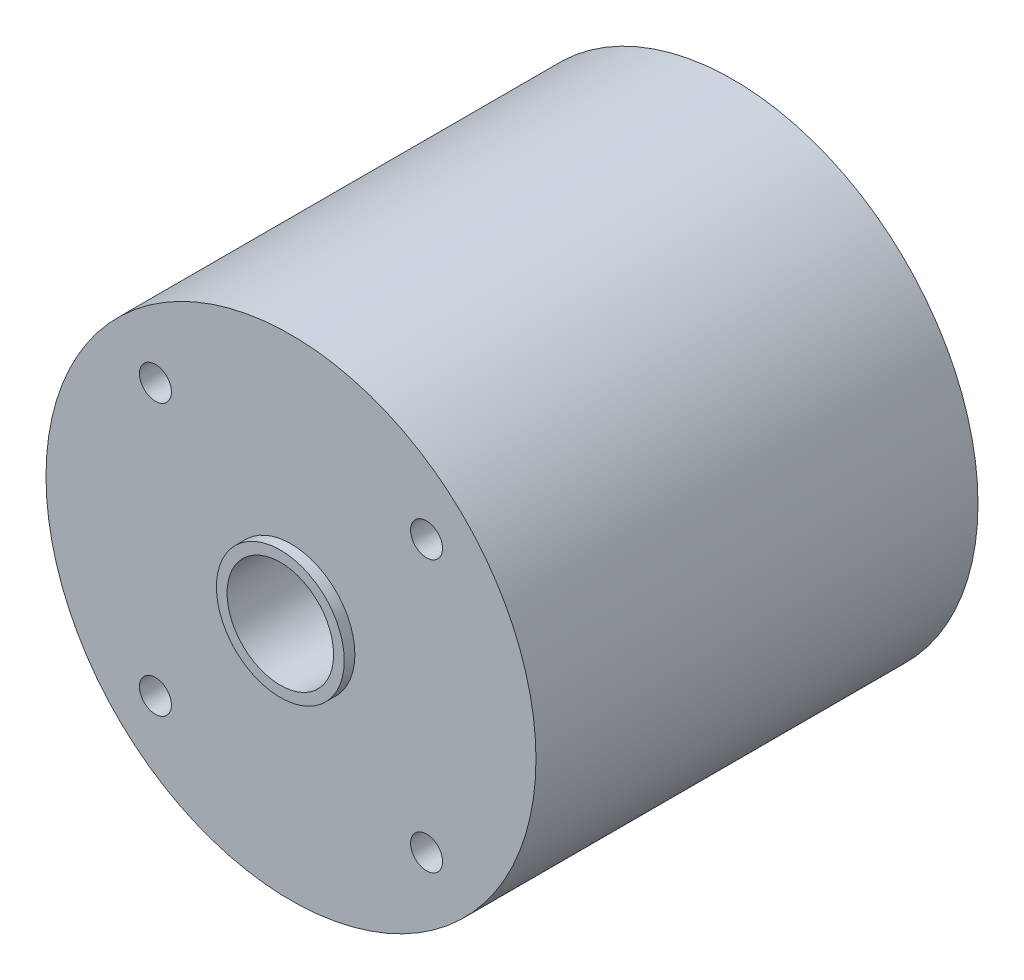
ISO-10303-21;
HEADER;
FILE_DESCRIPTION(('STEP AP214'),'2;1');
FILE_NAME('part.step','',(''),(''),'','','');
FILE_SCHEMA(('AUTOMOTIVE_DESIGN { 1 0 10303 214 1 1 1 1 }'));
ENDSEC;
DATA;
#1=APPLICATION_CONTEXT('core data for automotive mechanical design processes');
#2=APPLICATION_PROTOCOL_DEFINITION('international standard','automotive_design',2000,#1);
#3=PRODUCT_CONTEXT('',#1,'mechanical');
#4=PRODUCT('Part','Part','',(#3));
#5=PRODUCT_RELATED_PRODUCT_CATEGORY('part','',(#4));
#6=PRODUCT_DEFINITION_FORMATION('','',#4);
#7=PRODUCT_DEFINITION_CONTEXT('part definition',#1,'design');
#8=PRODUCT_DEFINITION('design','',#6,#7);
#9=PRODUCT_DEFINITION_SHAPE('','',#8);
#10=(LENGTH_UNIT() NAMED_UNIT(*) SI_UNIT(.MILLI.,.METRE.));
#11=(NAMED_UNIT(*) PLANE_ANGLE_UNIT() SI_UNIT($,.RADIAN.));
#12=(NAMED_UNIT(*) SI_UNIT($,.STERADIAN.) SOLID_ANGLE_UNIT());
#13=UNCERTAINTY_MEASURE_WITH_UNIT(LENGTH_MEASURE(1.E-05),#10,'distance_accuracy_value','');
#14=(GEOMETRIC_REPRESENTATION_CONTEXT(3) GLOBAL_UNCERTAINTY_ASSIGNED_CONTEXT((#13)) GLOBAL_UNIT_ASSIGNED_CONTEXT((#10,
#11,#12)) REPRESENTATION_CONTEXT('',''));
#15=CARTESIAN_POINT('',(0.,0.,0.));
#16=DIRECTION('',(0.,0.,1.));
#17=DIRECTION('',(1.,0.,0.));
#18=AXIS2_PLACEMENT_3D('',#15,#16,#17);
#19=CARTESIAN_POINT('',(0.,0.,-83.));
#20=DIRECTION('',(0.,0.,1.));
#21=DIRECTION('',(1.,0.,0.));
#22=AXIS2_PLACEMENT_3D('',#19,#20,#21);
#23=CYLINDRICAL_SURFACE('',#22,46.);
#24=CARTESIAN_POINT('',(0.,0.,-83.));
#25=DIRECTION('',(0.,0.,1.));
#26=DIRECTION('',(1.,0.,0.));
#27=AXIS2_PLACEMENT_3D('',#24,#25,#26);
#28=CIRCLE('',#27,46.);
#29=CARTESIAN_POINT('',(46.,0.,-83.));
#30=VERTEX_POINT('',#29);
#31=EDGE_CURVE('E11',#30,#30,#28,.T.);
#32=ORIENTED_EDGE('',*,*,#31,.T.);
#33=EDGE_LOOP('',(#32));
#34=FACE_BOUND('',#33,.T.);
#35=CARTESIAN_POINT('',(0.,0.,0.));
#36=DIRECTION('',(0.,0.,1.));
#37=DIRECTION('',(1.,0.,0.));
#38=AXIS2_PLACEMENT_3D('',#35,#36,#37);
#39=CIRCLE('',#38,46.);
#40=CARTESIAN_POINT('',(46.,0.,0.));
#41=VERTEX_POINT('',#40);
#42=EDGE_CURVE('E45',#41,#41,#39,.T.);
#43=ORIENTED_EDGE('',*,*,#42,.F.);
#44=EDGE_LOOP('',(#43));
#45=FACE_BOUND('',#44,.T.);
#46=ADVANCED_FACE('F42',(#34,#45),#23,.T.);
#47=CARTESIAN_POINT('',(0.,0.,-83.));
#48=DIRECTION('',(0.,0.,1.));
#49=DIRECTION('',(1.,0.,0.));
#50=AXIS2_PLACEMENT_3D('',#47,#48,#49);
#51=CYLINDRICAL_SURFACE('',#50,10.);
#52=CARTESIAN_POINT('',(0.,0.,2.));
#53=DIRECTION('',(0.,0.,1.));
#54=DIRECTION('',(1.,0.,0.));
#55=AXIS2_PLACEMENT_3D('',#52,#53,#54);
#56=CIRCLE('',#55,10.);
#57=CARTESIAN_POINT('',(10.,0.,2.));
#58=VERTEX_POINT('',#57);
#59=EDGE_CURVE('E57',#58,#58,#56,.T.);
#60=ORIENTED_EDGE('',*,*,#59,.T.);
#61=EDGE_LOOP('',(#60));
#62=FACE_BOUND('',#61,.T.);
#63=CARTESIAN_POINT('',(0.,0.,-85.));
#64=DIRECTION('',(0.,0.,1.));
#65=DIRECTION('',(1.,0.,0.));
#66=AXIS2_PLACEMENT_3D('',#63,#64,#65);
#67=CIRCLE('',#66,10.);
#68=CARTESIAN_POINT('',(10.,0.,-85.));
#69=VERTEX_POINT('',#68);
#70=EDGE_CURVE('E66',#69,#69,#67,.T.);
#71=ORIENTED_EDGE('',*,*,#70,.F.);
#72=EDGE_LOOP('',(#71));
#73=FACE_BOUND('',#72,.T.);
#74=ADVANCED_FACE('F113',(#62,#73),#51,.F.);
#75=CARTESIAN_POINT('',(0.,0.,-83.));
#76=DIRECTION('',(0.,0.,1.));
#77=DIRECTION('',(1.,0.,0.));
#78=AXIS2_PLACEMENT_3D('',#75,#76,#77);
#79=PLANE('',#78);
#80=CARTESIAN_POINT('',(-25.4558441227157,-25.4558441227157,-83.));
#81=DIRECTION('',(0.,0.,1.));
#82=DIRECTION('',(1.,0.,0.));
#83=AXIS2_PLACEMENT_3D('',#80,#81,#82);
#84=CIRCLE('',#83,3.00000000000035);
#85=CARTESIAN_POINT('',(-22.4558441227154,-25.4558441227157,-83.));
#86=VERTEX_POINT('',#85);
#87=EDGE_CURVE('E71',#86,#86,#84,.T.);
#88=ORIENTED_EDGE('',*,*,#87,.T.);
#89=EDGE_LOOP('',(#88));
#90=FACE_BOUND('',#89,.T.);
#91=CARTESIAN_POINT('',(25.4558441227157,-25.4558441227157,-83.));
#92=DIRECTION('',(0.,0.,1.));
#93=DIRECTION('',(1.,0.,0.));
#94=AXIS2_PLACEMENT_3D('',#91,#92,#93);
#95=CIRCLE('',#94,3.00000000000024);
#96=CARTESIAN_POINT('',(28.455844122716,-25.4558441227157,-83.));
#97=VERTEX_POINT('',#96);
#98=EDGE_CURVE('E74',#97,#97,#95,.T.);
#99=ORIENTED_EDGE('',*,*,#98,.T.);
#100=EDGE_LOOP('',(#99));
#101=FACE_BOUND('',#100,.T.);
#102=CARTESIAN_POINT('',(25.4558441227157,25.4558441227157,-83.));
#103=DIRECTION('',(0.,0.,1.));
#104=DIRECTION('',(1.,0.,0.));
#105=AXIS2_PLACEMENT_3D('',#102,#103,#104);
#106=CIRCLE('',#105,3.00000000000012);
#107=CARTESIAN_POINT('',(28.4558441227158,25.4558441227157,-83.));
#108=VERTEX_POINT('',#107);
#109=EDGE_CURVE('E77',#108,#108,#106,.T.);
#110=ORIENTED_EDGE('',*,*,#109,.T.);
#111=EDGE_LOOP('',(#110));
#112=FACE_BOUND('',#111,.T.);
#113=CARTESIAN_POINT('',(-25.4558441227157,25.4558441227157,-83.));
#114=DIRECTION('',(0.,0.,1.));
#115=DIRECTION('',(1.,0.,0.));
#116=AXIS2_PLACEMENT_3D('',#113,#114,#115);
#117=CIRCLE('',#116,3.);
#118=CARTESIAN_POINT('',(-22.4558441227157,25.4558441227157,-83.));
#119=VERTEX_POINT('',#118);
#120=EDGE_CURVE('E80',#119,#119,#117,.T.);
#121=ORIENTED_EDGE('',*,*,#120,.T.);
#122=EDGE_LOOP('',(#121));
#123=FACE_BOUND('',#122,.T.);
#124=CARTESIAN_POINT('',(0.,0.,-83.));
#125=DIRECTION('',(0.,0.,1.));
#126=DIRECTION('',(1.,0.,0.));
#127=AXIS2_PLACEMENT_3D('',#124,#125,#126);
#128=CIRCLE('',#127,12.);
#129=CARTESIAN_POINT('',(12.,0.,-83.));
#130=VERTEX_POINT('',#129);
#131=EDGE_CURVE('E63',#130,#130,#128,.T.);
#132=ORIENTED_EDGE('',*,*,#131,.T.);
#133=EDGE_LOOP('',(#132));
#134=FACE_BOUND('',#133,.T.);
#135=ORIENTED_EDGE('',*,*,#31,.F.);
#136=EDGE_LOOP('',(#135));
#137=FACE_BOUND('',#136,.T.);
#138=ADVANCED_FACE('F103',(#90,#101,#112,#123,#134,#137),#79,.F.);
#139=CARTESIAN_POINT('',(0.,0.,0.));
#140=DIRECTION('',(0.,0.,1.));
#141=DIRECTION('',(1.,0.,0.));
#142=AXIS2_PLACEMENT_3D('',#139,#140,#141);
#143=PLANE('',#142);
#144=CARTESIAN_POINT('',(-25.4558441227157,-25.4558441227157,0.));
#145=DIRECTION('',(0.,0.,1.));
#146=DIRECTION('',(1.,0.,0.));
#147=AXIS2_PLACEMENT_3D('',#144,#145,#146);
#148=CIRCLE('',#147,3.00000000000035);
#149=CARTESIAN_POINT('',(-22.4558441227154,-25.4558441227157,0.));
#150=VERTEX_POINT('',#149);
#151=EDGE_CURVE('E87',#150,#150,#148,.T.);
#152=ORIENTED_EDGE('',*,*,#151,.F.);
#153=EDGE_LOOP('',(#152));
#154=FACE_BOUND('',#153,.T.);
#155=CARTESIAN_POINT('',(25.4558441227157,-25.4558441227157,0.));
#156=DIRECTION('',(0.,0.,1.));
#157=DIRECTION('',(1.,0.,0.));
#158=AXIS2_PLACEMENT_3D('',#155,#156,#157);
#159=CIRCLE('',#158,3.00000000000024);
#160=CARTESIAN_POINT('',(28.455844122716,-25.4558441227157,0.));
#161=VERTEX_POINT('',#160);
#162=EDGE_CURVE('E90',#161,#161,#159,.T.);
#163=ORIENTED_EDGE('',*,*,#162,.F.);
#164=EDGE_LOOP('',(#163));
#165=FACE_BOUND('',#164,.T.);
#166=CARTESIAN_POINT('',(25.4558441227157,25.4558441227157,0.));
#167=DIRECTION('',(0.,0.,1.));
#168=DIRECTION('',(1.,0.,0.));
#169=AXIS2_PLACEMENT_3D('',#166,#167,#168);
#170=CIRCLE('',#169,3.00000000000012);
#171=CARTESIAN_POINT('',(28.4558441227158,25.4558441227157,0.));
#172=VERTEX_POINT('',#171);
#173=EDGE_CURVE('E86',#172,#172,#170,.T.);
#174=ORIENTED_EDGE('',*,*,#173,.F.);
#175=EDGE_LOOP('',(#174));
#176=FACE_BOUND('',#175,.T.);
#177=CARTESIAN_POINT('',(-25.4558441227157,25.4558441227157,0.));
#178=DIRECTION('',(0.,0.,1.));
#179=DIRECTION('',(1.,0.,0.));
#180=AXIS2_PLACEMENT_3D('',#177,#178,#179);
#181=CIRCLE('',#180,3.);
#182=CARTESIAN_POINT('',(-22.4558441227157,25.4558441227157,0.));
#183=VERTEX_POINT('',#182);
#184=EDGE_CURVE('E83',#183,#183,#181,.T.);
#185=ORIENTED_EDGE('',*,*,#184,.F.);
#186=EDGE_LOOP('',(#185));
#187=FACE_BOUND('',#186,.T.);
#188=CARTESIAN_POINT('',(0.,0.,0.));
#189=DIRECTION('',(0.,0.,1.));
#190=DIRECTION('',(1.,0.,0.));
#191=AXIS2_PLACEMENT_3D('',#188,#189,#190);
#192=CIRCLE('',#191,12.);
#193=CARTESIAN_POINT('',(12.,0.,0.));
#194=VERTEX_POINT('',#193);
#195=EDGE_CURVE('E54',#194,#194,#192,.T.);
#196=ORIENTED_EDGE('',*,*,#195,.F.);
#197=EDGE_LOOP('',(#196));
#198=FACE_BOUND('',#197,.T.);
#199=ORIENTED_EDGE('',*,*,#42,.T.);
#200=EDGE_LOOP('',(#199));
#201=FACE_BOUND('',#200,.T.);
#202=ADVANCED_FACE('F99',(#154,#165,#176,#187,#198,#201),#143,.T.);
#203=CARTESIAN_POINT('',(0.,0.,2.));
#204=DIRECTION('',(0.,0.,-1.));
#205=DIRECTION('',(-1.,0.,0.));
#206=AXIS2_PLACEMENT_3D('',#203,#204,#205);
#207=CYLINDRICAL_SURFACE('',#206,12.);
#208=CARTESIAN_POINT('',(0.,0.,2.));
#209=DIRECTION('',(0.,0.,1.));
#210=DIRECTION('',(1.,0.,0.));
#211=AXIS2_PLACEMENT_3D('',#208,#209,#210);
#212=CIRCLE('',#211,12.);
#213=CARTESIAN_POINT('',(12.,0.,2.));
#214=VERTEX_POINT('',#213);
#215=EDGE_CURVE('E52',#214,#214,#212,.T.);
#216=ORIENTED_EDGE('',*,*,#215,.F.);
#217=EDGE_LOOP('',(#216));
#218=FACE_BOUND('',#217,.T.);
#219=ORIENTED_EDGE('',*,*,#195,.T.);
#220=EDGE_LOOP('',(#219));
#221=FACE_BOUND('',#220,.T.);
#222=ADVANCED_FACE('F102',(#218,#221),#207,.T.);
#223=CARTESIAN_POINT('',(0.,0.,2.));
#224=DIRECTION('',(0.,0.,1.));
#225=DIRECTION('',(1.,0.,0.));
#226=AXIS2_PLACEMENT_3D('',#223,#224,#225);
#227=PLANE('',#226);
#228=ORIENTED_EDGE('',*,*,#59,.F.);
#229=EDGE_LOOP('',(#228));
#230=FACE_BOUND('',#229,.T.);
#231=ORIENTED_EDGE('',*,*,#215,.T.);
#232=EDGE_LOOP('',(#231));
#233=FACE_BOUND('',#232,.T.);
#234=ADVANCED_FACE('F127',(#230,#233),#227,.T.);
#235=CARTESIAN_POINT('',(0.,0.,-85.));
#236=DIRECTION('',(0.,0.,1.));
#237=DIRECTION('',(1.,0.,0.));
#238=AXIS2_PLACEMENT_3D('',#235,#236,#237);
#239=CYLINDRICAL_SURFACE('',#238,12.);
#240=CARTESIAN_POINT('',(0.,0.,-85.));
#241=DIRECTION('',(0.,0.,1.));
#242=DIRECTION('',(1.,0.,0.));
#243=AXIS2_PLACEMENT_3D('',#240,#241,#242);
#244=CIRCLE('',#243,12.);
#245=CARTESIAN_POINT('',(12.,0.,-85.));
#246=VERTEX_POINT('',#245);
#247=EDGE_CURVE('E58',#246,#246,#244,.T.);
#248=ORIENTED_EDGE('',*,*,#247,.T.);
#249=EDGE_LOOP('',(#248));
#250=FACE_BOUND('',#249,.T.);
#251=ORIENTED_EDGE('',*,*,#131,.F.);
#252=EDGE_LOOP('',(#251));
#253=FACE_BOUND('',#252,.T.);
#254=ADVANCED_FACE('F131',(#250,#253),#239,.T.);
#255=CARTESIAN_POINT('',(0.,0.,-85.));
#256=DIRECTION('',(0.,0.,1.));
#257=DIRECTION('',(1.,0.,0.));
#258=AXIS2_PLACEMENT_3D('',#255,#256,#257);
#259=PLANE('',#258);
#260=ORIENTED_EDGE('',*,*,#70,.T.);
#261=EDGE_LOOP('',(#260));
#262=FACE_BOUND('',#261,.T.);
#263=ORIENTED_EDGE('',*,*,#247,.F.);
#264=EDGE_LOOP('',(#263));
#265=FACE_BOUND('',#264,.T.);
#266=ADVANCED_FACE('F135',(#262,#265),#259,.F.);
#267=CARTESIAN_POINT('',(-25.4558441227157,25.4558441227157,-100.));
#268=DIRECTION('',(0.,0.,1.));
#269=DIRECTION('',(1.,0.,0.));
#270=AXIS2_PLACEMENT_3D('',#267,#268,#269);
#271=CYLINDRICAL_SURFACE('',#270,3.);
#272=ORIENTED_EDGE('',*,*,#184,.T.);
#273=EDGE_LOOP('',(#272));
#274=FACE_BOUND('',#273,.T.);
#275=ORIENTED_EDGE('',*,*,#120,.F.);
#276=EDGE_LOOP('',(#275));
#277=FACE_BOUND('',#276,.T.);
#278=ADVANCED_FACE('F139',(#274,#277),#271,.F.);
#279=CARTESIAN_POINT('',(25.4558441227157,25.4558441227157,-100.));
#280=DIRECTION('',(0.,0.,1.));
#281=DIRECTION('',(1.,0.,0.));
#282=AXIS2_PLACEMENT_3D('',#279,#280,#281);
#283=CYLINDRICAL_SURFACE('',#282,3.00000000000012);
#284=ORIENTED_EDGE('',*,*,#173,.T.);
#285=EDGE_LOOP('',(#284));
#286=FACE_BOUND('',#285,.T.);
#287=ORIENTED_EDGE('',*,*,#109,.F.);
#288=EDGE_LOOP('',(#287));
#289=FACE_BOUND('',#288,.T.);
#290=ADVANCED_FACE('F96',(#286,#289),#283,.F.);
#291=CARTESIAN_POINT('',(25.4558441227157,-25.4558441227157,-100.));
#292=DIRECTION('',(0.,0.,1.));
#293=DIRECTION('',(1.,0.,0.));
#294=AXIS2_PLACEMENT_3D('',#291,#292,#293);
#295=CYLINDRICAL_SURFACE('',#294,3.00000000000024);
#296=ORIENTED_EDGE('',*,*,#162,.T.);
#297=EDGE_LOOP('',(#296));
#298=FACE_BOUND('',#297,.T.);
#299=ORIENTED_EDGE('',*,*,#98,.F.);
#300=EDGE_LOOP('',(#299));
#301=FACE_BOUND('',#300,.T.);
#302=ADVANCED_FACE('F147',(#298,#301),#295,.F.);
#303=CARTESIAN_POINT('',(-25.4558441227157,-25.4558441227157,-100.));
#304=DIRECTION('',(0.,0.,1.));
#305=DIRECTION('',(1.,0.,0.));
#306=AXIS2_PLACEMENT_3D('',#303,#304,#305);
#307=CYLINDRICAL_SURFACE('',#306,3.00000000000035);
#308=ORIENTED_EDGE('',*,*,#151,.T.);
#309=EDGE_LOOP('',(#308));
#310=FACE_BOUND('',#309,.T.);
#311=ORIENTED_EDGE('',*,*,#87,.F.);
#312=EDGE_LOOP('',(#311));
#313=FACE_BOUND('',#312,.T.);
#314=ADVANCED_FACE('F144',(#310,#313),#307,.F.);
#315=CLOSED_SHELL('',(#46,#74,#138,#202,#222,#234,#254,#266,#278,#290,#302,#314));
#316=MANIFOLD_SOLID_BREP('B2',#315);
#317=ADVANCED_BREP_SHAPE_REPRESENTATION('',(#18,#316),#14);
#318=SHAPE_DEFINITION_REPRESENTATION(#9,#317);
ENDSEC;
END-ISO-10303-21;
